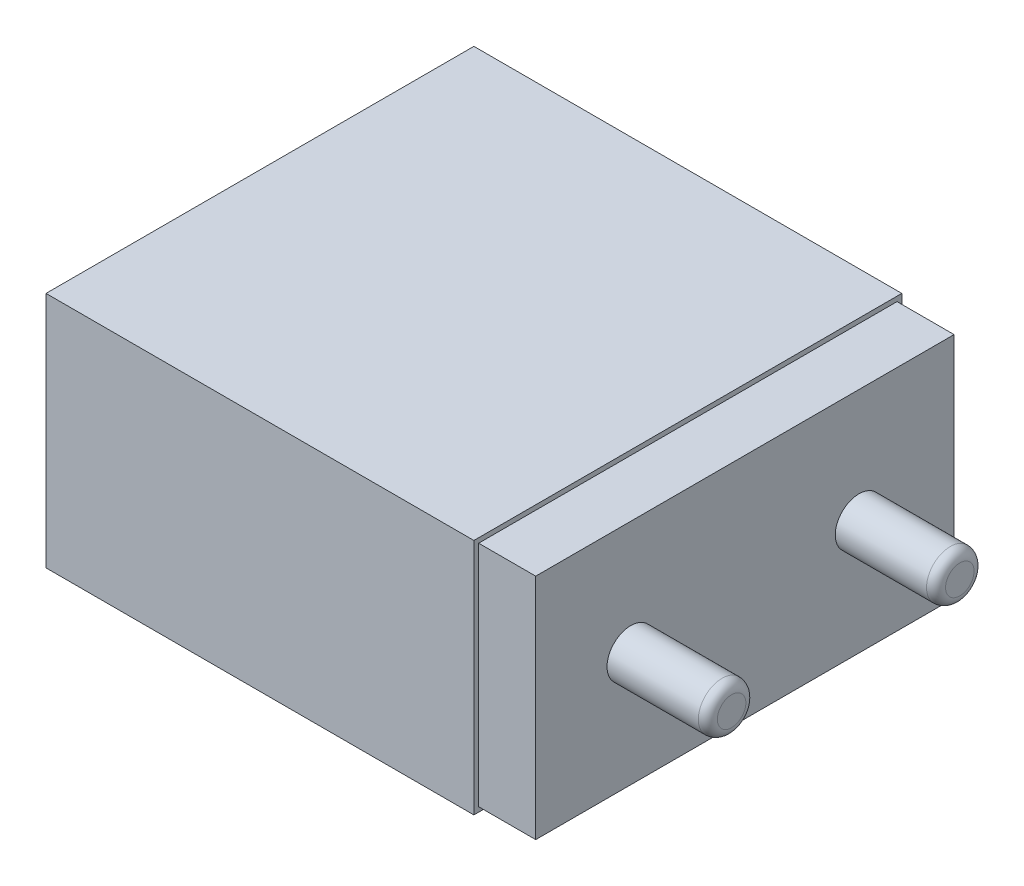
ISO-10303-21;
HEADER;
FILE_DESCRIPTION(('STEP AP214'),'2;1');
FILE_NAME('part.step','',(''),(''),'','','');
FILE_SCHEMA(('AUTOMOTIVE_DESIGN { 1 0 10303 214 1 1 1 1 }'));
ENDSEC;
DATA;
#1=APPLICATION_CONTEXT('core data for automotive mechanical design processes');
#2=APPLICATION_PROTOCOL_DEFINITION('international standard','automotive_design',2000,#1);
#3=PRODUCT_CONTEXT('',#1,'mechanical');
#4=PRODUCT('Part','Part','',(#3));
#5=PRODUCT_RELATED_PRODUCT_CATEGORY('part','',(#4));
#6=PRODUCT_DEFINITION_FORMATION('','',#4);
#7=PRODUCT_DEFINITION_CONTEXT('part definition',#1,'design');
#8=PRODUCT_DEFINITION('design','',#6,#7);
#9=PRODUCT_DEFINITION_SHAPE('','',#8);
#10=(LENGTH_UNIT() NAMED_UNIT(*) SI_UNIT(.MILLI.,.METRE.));
#11=(NAMED_UNIT(*) PLANE_ANGLE_UNIT() SI_UNIT($,.RADIAN.));
#12=(NAMED_UNIT(*) SI_UNIT($,.STERADIAN.) SOLID_ANGLE_UNIT());
#13=UNCERTAINTY_MEASURE_WITH_UNIT(LENGTH_MEASURE(1.E-05),#10,'distance_accuracy_value','');
#14=(GEOMETRIC_REPRESENTATION_CONTEXT(3) GLOBAL_UNCERTAINTY_ASSIGNED_CONTEXT((#13)) GLOBAL_UNIT_ASSIGNED_CONTEXT((#10,
#11,#12)) REPRESENTATION_CONTEXT('',''));
#15=CARTESIAN_POINT('',(0.,0.,0.));
#16=DIRECTION('',(0.,0.,1.));
#17=DIRECTION('',(1.,0.,0.));
#18=AXIS2_PLACEMENT_3D('',#15,#16,#17);
#19=CARTESIAN_POINT('',(-25.5789473684211,25.,-29.2105263157895));
#20=DIRECTION('',(1.,0.,0.));
#21=DIRECTION('',(0.,0.,-1.));
#22=AXIS2_PLACEMENT_3D('',#19,#20,#21);
#23=PLANE('',#22);
#24=DIRECTION('',(0.,0.,1.));
#25=VECTOR('',#24,1.);
#26=CARTESIAN_POINT('',(-25.5789473684211,0.,-29.2105263157895));
#27=LINE('',#26,#25);
#28=CARTESIAN_POINT('',(-25.5789473684211,0.,-29.2105263157895));
#29=VERTEX_POINT('',#28);
#30=CARTESIAN_POINT('',(-25.5789473684211,0.,15.7894736842105));
#31=VERTEX_POINT('',#30);
#32=EDGE_CURVE('E367',#29,#31,#27,.T.);
#33=ORIENTED_EDGE('',*,*,#32,.T.);
#34=DIRECTION('',(0.,-1.,0.));
#35=VECTOR('',#34,1.);
#36=CARTESIAN_POINT('',(-25.5789473684211,25.,15.7894736842105));
#37=LINE('',#36,#35);
#38=CARTESIAN_POINT('',(-25.5789473684211,25.,15.7894736842105));
#39=VERTEX_POINT('',#38);
#40=EDGE_CURVE('E405',#39,#31,#37,.T.);
#41=ORIENTED_EDGE('',*,*,#40,.F.);
#42=DIRECTION('',(0.,0.,1.));
#43=VECTOR('',#42,1.);
#44=CARTESIAN_POINT('',(-25.5789473684211,25.,-29.2105263157895));
#45=LINE('',#44,#43);
#46=CARTESIAN_POINT('',(-25.5789473684211,25.,-29.2105263157895));
#47=VERTEX_POINT('',#46);
#48=EDGE_CURVE('E368',#47,#39,#45,.T.);
#49=ORIENTED_EDGE('',*,*,#48,.F.);
#50=DIRECTION('',(0.,-1.,0.));
#51=VECTOR('',#50,1.);
#52=CARTESIAN_POINT('',(-25.5789473684211,25.,-29.2105263157895));
#53=LINE('',#52,#51);
#54=EDGE_CURVE('E382',#47,#29,#53,.T.);
#55=ORIENTED_EDGE('',*,*,#54,.T.);
#56=EDGE_LOOP('',(#33,#41,#49,#55));
#57=FACE_BOUND('',#56,.T.);
#58=DIRECTION('',(0.,0.,1.));
#59=VECTOR('',#58,1.);
#60=CARTESIAN_POINT('',(-25.5789473684211,7.95309160376509,-14.2105263157895));
#61=LINE('',#60,#59);
#62=CARTESIAN_POINT('',(-25.5789473684211,7.9530916037651,-14.2105263157895));
#63=VERTEX_POINT('',#62);
#64=CARTESIAN_POINT('',(-25.5789473684211,7.95309160376509,-9.21052631578947));
#65=VERTEX_POINT('',#64);
#66=EDGE_CURVE('E293',#63,#65,#61,.T.);
#67=ORIENTED_EDGE('',*,*,#66,.F.);
#68=DIRECTION('',(0.,-1.,0.));
#69=VECTOR('',#68,1.);
#70=CARTESIAN_POINT('',(-25.5789473684211,18.4530916037651,-14.2105263157895));
#71=LINE('',#70,#69);
#72=CARTESIAN_POINT('',(-25.5789473684211,18.4530916037651,-14.2105263157895));
#73=VERTEX_POINT('',#72);
#74=EDGE_CURVE('E226',#73,#63,#71,.T.);
#75=ORIENTED_EDGE('',*,*,#74,.F.);
#76=DIRECTION('',(0.,0.,-1.));
#77=VECTOR('',#76,1.);
#78=CARTESIAN_POINT('',(-25.5789473684211,18.4530916037651,-14.2105263157895));
#79=LINE('',#78,#77);
#80=CARTESIAN_POINT('',(-25.5789473684211,18.4530916037651,-9.21052631578947));
#81=VERTEX_POINT('',#80);
#82=EDGE_CURVE('E278',#81,#73,#79,.T.);
#83=ORIENTED_EDGE('',*,*,#82,.F.);
#84=DIRECTION('',(0.,1.,0.));
#85=VECTOR('',#84,1.);
#86=CARTESIAN_POINT('',(-25.5789473684211,18.4530916037651,-9.21052631578947));
#87=LINE('',#86,#85);
#88=EDGE_CURVE('E297',#65,#81,#87,.T.);
#89=ORIENTED_EDGE('',*,*,#88,.F.);
#90=EDGE_LOOP('',(#67,#75,#83,#89));
#91=FACE_BOUND('',#90,.T.);
#92=DIRECTION('',(0.,0.,1.));
#93=VECTOR('',#92,1.);
#94=CARTESIAN_POINT('',(-25.5789473684211,7.95309160376509,-24.2105263157895));
#95=LINE('',#94,#93);
#96=CARTESIAN_POINT('',(-25.5789473684211,7.95309160376509,-24.2105263157895));
#97=VERTEX_POINT('',#96);
#98=CARTESIAN_POINT('',(-25.5789473684211,7.95309160376509,-19.2105263157895));
#99=VERTEX_POINT('',#98);
#100=EDGE_CURVE('E248',#97,#99,#95,.T.);
#101=ORIENTED_EDGE('',*,*,#100,.F.);
#102=DIRECTION('',(0.,-1.,0.));
#103=VECTOR('',#102,1.);
#104=CARTESIAN_POINT('',(-25.5789473684211,18.4530916037651,-24.2105263157895));
#105=LINE('',#104,#103);
#106=CARTESIAN_POINT('',(-25.5789473684211,18.4530916037651,-24.2105263157895));
#107=VERTEX_POINT('',#106);
#108=EDGE_CURVE('E245',#107,#97,#105,.T.);
#109=ORIENTED_EDGE('',*,*,#108,.F.);
#110=DIRECTION('',(0.,0.,-1.));
#111=VECTOR('',#110,1.);
#112=CARTESIAN_POINT('',(-25.5789473684211,18.4530916037651,-24.2105263157895));
#113=LINE('',#112,#111);
#114=CARTESIAN_POINT('',(-25.5789473684211,18.4530916037651,-19.2105263157895));
#115=VERTEX_POINT('',#114);
#116=EDGE_CURVE('E232',#115,#107,#113,.T.);
#117=ORIENTED_EDGE('',*,*,#116,.F.);
#118=DIRECTION('',(0.,1.,0.));
#119=VECTOR('',#118,1.);
#120=CARTESIAN_POINT('',(-25.5789473684211,18.4530916037651,-19.2105263157895));
#121=LINE('',#120,#119);
#122=EDGE_CURVE('E253',#99,#115,#121,.T.);
#123=ORIENTED_EDGE('',*,*,#122,.F.);
#124=EDGE_LOOP('',(#101,#109,#117,#123));
#125=FACE_BOUND('',#124,.T.);
#126=DIRECTION('',(0.,-1.,0.));
#127=VECTOR('',#126,1.);
#128=CARTESIAN_POINT('',(-25.5789473684211,18.4530916037651,-4.21052631578948));
#129=LINE('',#128,#127);
#130=CARTESIAN_POINT('',(-25.5789473684211,18.4530916037651,-4.21052631578948));
#131=VERTEX_POINT('',#130);
#132=CARTESIAN_POINT('',(-25.5789473684211,7.9530916037651,-4.21052631578947));
#133=VERTEX_POINT('',#132);
#134=EDGE_CURVE('E192',#131,#133,#129,.T.);
#135=ORIENTED_EDGE('',*,*,#134,.F.);
#136=DIRECTION('',(0.,0.,-1.));
#137=VECTOR('',#136,1.);
#138=CARTESIAN_POINT('',(-25.5789473684211,18.4530916037651,-4.21052631578948));
#139=LINE('',#138,#137);
#140=CARTESIAN_POINT('',(-25.5789473684211,18.4530916037651,10.7894736842105));
#141=VERTEX_POINT('',#140);
#142=EDGE_CURVE('E198',#141,#131,#139,.T.);
#143=ORIENTED_EDGE('',*,*,#142,.F.);
#144=DIRECTION('',(0.,1.,0.));
#145=VECTOR('',#144,1.);
#146=CARTESIAN_POINT('',(-25.5789473684211,18.4530916037651,10.7894736842105));
#147=LINE('',#146,#145);
#148=CARTESIAN_POINT('',(-25.5789473684211,7.9530916037651,10.7894736842105));
#149=VERTEX_POINT('',#148);
#150=EDGE_CURVE('E212',#149,#141,#147,.T.);
#151=ORIENTED_EDGE('',*,*,#150,.F.);
#152=DIRECTION('',(0.,0.,1.));
#153=VECTOR('',#152,1.);
#154=CARTESIAN_POINT('',(-25.5789473684211,7.95309160376509,-4.21052631578947));
#155=LINE('',#154,#153);
#156=EDGE_CURVE('E206',#133,#149,#155,.T.);
#157=ORIENTED_EDGE('',*,*,#156,.F.);
#158=EDGE_LOOP('',(#135,#143,#151,#157));
#159=FACE_BOUND('',#158,.T.);
#160=ADVANCED_FACE('F41',(#57,#91,#125,#159),#23,.F.);
#161=CARTESIAN_POINT('',(19.4210526315789,25.,-29.2105263157895));
#162=DIRECTION('',(-1.,0.,0.));
#163=DIRECTION('',(0.,0.,1.));
#164=AXIS2_PLACEMENT_3D('',#161,#162,#163);
#165=PLANE('',#164);
#166=DIRECTION('',(0.,0.,-1.));
#167=VECTOR('',#166,1.);
#168=CARTESIAN_POINT('',(19.4210526315789,0.,-29.2105263157895));
#169=LINE('',#168,#167);
#170=CARTESIAN_POINT('',(19.4210526315789,0.,15.7894736842105));
#171=VERTEX_POINT('',#170);
#172=CARTESIAN_POINT('',(19.4210526315789,0.,-29.2105263157895));
#173=VERTEX_POINT('',#172);
#174=EDGE_CURVE('E389',#171,#173,#169,.T.);
#175=ORIENTED_EDGE('',*,*,#174,.T.);
#176=DIRECTION('',(0.,-1.,0.));
#177=VECTOR('',#176,1.);
#178=CARTESIAN_POINT('',(19.4210526315789,25.,-29.2105263157895));
#179=LINE('',#178,#177);
#180=CARTESIAN_POINT('',(19.4210526315789,25.,-29.2105263157895));
#181=VERTEX_POINT('',#180);
#182=EDGE_CURVE('E397',#181,#173,#179,.T.);
#183=ORIENTED_EDGE('',*,*,#182,.F.);
#184=DIRECTION('',(0.,0.,-1.));
#185=VECTOR('',#184,1.);
#186=CARTESIAN_POINT('',(19.4210526315789,25.,-29.2105263157895));
#187=LINE('',#186,#185);
#188=CARTESIAN_POINT('',(19.4210526315789,25.,15.7894736842105));
#189=VERTEX_POINT('',#188);
#190=EDGE_CURVE('E376',#189,#181,#187,.T.);
#191=ORIENTED_EDGE('',*,*,#190,.F.);
#192=DIRECTION('',(0.,-1.,0.));
#193=VECTOR('',#192,1.);
#194=CARTESIAN_POINT('',(19.4210526315789,25.,15.7894736842105));
#195=LINE('',#194,#193);
#196=EDGE_CURVE('E401',#189,#171,#195,.T.);
#197=ORIENTED_EDGE('',*,*,#196,.T.);
#198=EDGE_LOOP('',(#175,#183,#191,#197));
#199=FACE_BOUND('',#198,.T.);
#200=DIRECTION('',(0.,-1.,0.));
#201=VECTOR('',#200,1.);
#202=CARTESIAN_POINT('',(19.4210526315789,24.5,15.2894736842105));
#203=LINE('',#202,#201);
#204=CARTESIAN_POINT('',(19.4210526315789,24.5,15.2894736842105));
#205=VERTEX_POINT('',#204);
#206=CARTESIAN_POINT('',(19.4210526315789,0.5,15.2894736842105));
#207=VERTEX_POINT('',#206);
#208=EDGE_CURVE('E322',#205,#207,#203,.T.);
#209=ORIENTED_EDGE('',*,*,#208,.F.);
#210=DIRECTION('',(0.,0.,1.));
#211=VECTOR('',#210,1.);
#212=CARTESIAN_POINT('',(19.4210526315789,24.5,15.2894736842105));
#213=LINE('',#212,#211);
#214=CARTESIAN_POINT('',(19.4210526315789,24.5,-28.7105263157895));
#215=VERTEX_POINT('',#214);
#216=EDGE_CURVE('E328',#215,#205,#213,.T.);
#217=ORIENTED_EDGE('',*,*,#216,.F.);
#218=DIRECTION('',(0.,1.,0.));
#219=VECTOR('',#218,1.);
#220=CARTESIAN_POINT('',(19.4210526315789,24.5,-28.7105263157895));
#221=LINE('',#220,#219);
#222=CARTESIAN_POINT('',(19.4210526315789,0.5,-28.7105263157895));
#223=VERTEX_POINT('',#222);
#224=EDGE_CURVE('E345',#223,#215,#221,.T.);
#225=ORIENTED_EDGE('',*,*,#224,.F.);
#226=DIRECTION('',(0.,0.,-1.));
#227=VECTOR('',#226,1.);
#228=CARTESIAN_POINT('',(19.4210526315789,0.5,15.2894736842105));
#229=LINE('',#228,#227);
#230=EDGE_CURVE('E341',#207,#223,#229,.T.);
#231=ORIENTED_EDGE('',*,*,#230,.F.);
#232=EDGE_LOOP('',(#209,#217,#225,#231));
#233=FACE_BOUND('',#232,.T.);
#234=ADVANCED_FACE('F485',(#199,#233),#165,.F.);
#235=CARTESIAN_POINT('',(-25.5789473684211,25.,15.7894736842105));
#236=DIRECTION('',(0.,0.,-1.));
#237=DIRECTION('',(-1.,0.,0.));
#238=AXIS2_PLACEMENT_3D('',#235,#236,#237);
#239=PLANE('',#238);
#240=DIRECTION('',(1.,0.,0.));
#241=VECTOR('',#240,1.);
#242=CARTESIAN_POINT('',(-25.5789473684211,0.,15.7894736842105));
#243=LINE('',#242,#241);
#244=EDGE_CURVE('E386',#31,#171,#243,.T.);
#245=ORIENTED_EDGE('',*,*,#244,.T.);
#246=ORIENTED_EDGE('',*,*,#196,.F.);
#247=DIRECTION('',(1.,0.,0.));
#248=VECTOR('',#247,1.);
#249=CARTESIAN_POINT('',(-25.5789473684211,25.,15.7894736842105));
#250=LINE('',#249,#248);
#251=EDGE_CURVE('E372',#39,#189,#250,.T.);
#252=ORIENTED_EDGE('',*,*,#251,.F.);
#253=ORIENTED_EDGE('',*,*,#40,.T.);
#254=EDGE_LOOP('',(#245,#246,#252,#253));
#255=FACE_BOUND('',#254,.T.);
#256=ADVANCED_FACE('F491',(#255),#239,.F.);
#257=CARTESIAN_POINT('',(-25.5789473684211,25.,-29.2105263157895));
#258=DIRECTION('',(0.,0.,1.));
#259=DIRECTION('',(1.,0.,0.));
#260=AXIS2_PLACEMENT_3D('',#257,#258,#259);
#261=PLANE('',#260);
#262=DIRECTION('',(-1.,0.,0.));
#263=VECTOR('',#262,1.);
#264=CARTESIAN_POINT('',(-25.5789473684211,0.,-29.2105263157895));
#265=LINE('',#264,#263);
#266=EDGE_CURVE('E373',#173,#29,#265,.T.);
#267=ORIENTED_EDGE('',*,*,#266,.T.);
#268=ORIENTED_EDGE('',*,*,#54,.F.);
#269=DIRECTION('',(-1.,0.,0.));
#270=VECTOR('',#269,1.);
#271=CARTESIAN_POINT('',(-25.5789473684211,25.,-29.2105263157895));
#272=LINE('',#271,#270);
#273=EDGE_CURVE('E379',#181,#47,#272,.T.);
#274=ORIENTED_EDGE('',*,*,#273,.F.);
#275=ORIENTED_EDGE('',*,*,#182,.T.);
#276=EDGE_LOOP('',(#267,#268,#274,#275));
#277=FACE_BOUND('',#276,.T.);
#278=ADVANCED_FACE('F770',(#277),#261,.F.);
#279=CARTESIAN_POINT('',(0.,25.,0.));
#280=DIRECTION('',(0.,1.,0.));
#281=DIRECTION('',(0.,0.,1.));
#282=AXIS2_PLACEMENT_3D('',#279,#280,#281);
#283=PLANE('',#282);
#284=ORIENTED_EDGE('',*,*,#48,.T.);
#285=ORIENTED_EDGE('',*,*,#251,.T.);
#286=ORIENTED_EDGE('',*,*,#190,.T.);
#287=ORIENTED_EDGE('',*,*,#273,.T.);
#288=EDGE_LOOP('',(#284,#285,#286,#287));
#289=FACE_BOUND('',#288,.T.);
#290=ADVANCED_FACE('F761',(#289),#283,.T.);
#291=CARTESIAN_POINT('',(0.,0.,0.));
#292=DIRECTION('',(0.,1.,0.));
#293=DIRECTION('',(0.,0.,1.));
#294=AXIS2_PLACEMENT_3D('',#291,#292,#293);
#295=PLANE('',#294);
#296=ORIENTED_EDGE('',*,*,#32,.F.);
#297=ORIENTED_EDGE('',*,*,#266,.F.);
#298=ORIENTED_EDGE('',*,*,#174,.F.);
#299=ORIENTED_EDGE('',*,*,#244,.F.);
#300=EDGE_LOOP('',(#296,#297,#298,#299));
#301=FACE_BOUND('',#300,.T.);
#302=ADVANCED_FACE('F747',(#301),#295,.F.);
#303=CARTESIAN_POINT('',(25.4210526315789,24.5,15.2894736842105));
#304=DIRECTION('',(0.,0.,-1.));
#305=DIRECTION('',(-1.,0.,0.));
#306=AXIS2_PLACEMENT_3D('',#303,#304,#305);
#307=PLANE('',#306);
#308=ORIENTED_EDGE('',*,*,#208,.T.);
#309=DIRECTION('',(-1.,0.,0.));
#310=VECTOR('',#309,1.);
#311=CARTESIAN_POINT('',(25.4210526315789,0.5,15.2894736842105));
#312=LINE('',#311,#310);
#313=CARTESIAN_POINT('',(25.4210526315789,0.5,15.2894736842105));
#314=VERTEX_POINT('',#313);
#315=EDGE_CURVE('E363',#314,#207,#312,.T.);
#316=ORIENTED_EDGE('',*,*,#315,.F.);
#317=DIRECTION('',(0.,-1.,0.));
#318=VECTOR('',#317,1.);
#319=CARTESIAN_POINT('',(25.4210526315789,24.5,15.2894736842105));
#320=LINE('',#319,#318);
#321=CARTESIAN_POINT('',(25.4210526315789,24.5,15.2894736842105));
#322=VERTEX_POINT('',#321);
#323=EDGE_CURVE('E323',#322,#314,#320,.T.);
#324=ORIENTED_EDGE('',*,*,#323,.F.);
#325=DIRECTION('',(-1.,0.,0.));
#326=VECTOR('',#325,1.);
#327=CARTESIAN_POINT('',(25.4210526315789,24.5,15.2894736842105));
#328=LINE('',#327,#326);
#329=EDGE_CURVE('E337',#322,#205,#328,.T.);
#330=ORIENTED_EDGE('',*,*,#329,.T.);
#331=EDGE_LOOP('',(#308,#316,#324,#330));
#332=FACE_BOUND('',#331,.T.);
#333=ADVANCED_FACE('F738',(#332),#307,.F.);
#334=CARTESIAN_POINT('',(25.4210526315789,0.5,15.2894736842105));
#335=DIRECTION('',(0.,1.,0.));
#336=DIRECTION('',(0.,0.,1.));
#337=AXIS2_PLACEMENT_3D('',#334,#335,#336);
#338=PLANE('',#337);
#339=ORIENTED_EDGE('',*,*,#230,.T.);
#340=DIRECTION('',(-1.,0.,0.));
#341=VECTOR('',#340,1.);
#342=CARTESIAN_POINT('',(25.4210526315789,0.5,-28.7105263157895));
#343=LINE('',#342,#341);
#344=CARTESIAN_POINT('',(25.4210526315789,0.5,-28.7105263157895));
#345=VERTEX_POINT('',#344);
#346=EDGE_CURVE('E359',#345,#223,#343,.T.);
#347=ORIENTED_EDGE('',*,*,#346,.F.);
#348=DIRECTION('',(0.,0.,-1.));
#349=VECTOR('',#348,1.);
#350=CARTESIAN_POINT('',(25.4210526315789,0.5,15.2894736842105));
#351=LINE('',#350,#349);
#352=EDGE_CURVE('E327',#314,#345,#351,.T.);
#353=ORIENTED_EDGE('',*,*,#352,.F.);
#354=ORIENTED_EDGE('',*,*,#315,.T.);
#355=EDGE_LOOP('',(#339,#347,#353,#354));
#356=FACE_BOUND('',#355,.T.);
#357=ADVANCED_FACE('F729',(#356),#338,.F.);
#358=CARTESIAN_POINT('',(25.4210526315789,24.5,-28.7105263157895));
#359=DIRECTION('',(0.,0.,1.));
#360=DIRECTION('',(0.,-1.,0.));
#361=AXIS2_PLACEMENT_3D('',#358,#359,#360);
#362=PLANE('',#361);
#363=ORIENTED_EDGE('',*,*,#224,.T.);
#364=DIRECTION('',(-1.,0.,0.));
#365=VECTOR('',#364,1.);
#366=CARTESIAN_POINT('',(25.4210526315789,24.5,-28.7105263157895));
#367=LINE('',#366,#365);
#368=CARTESIAN_POINT('',(25.4210526315789,24.5,-28.7105263157895));
#369=VERTEX_POINT('',#368);
#370=EDGE_CURVE('E355',#369,#215,#367,.T.);
#371=ORIENTED_EDGE('',*,*,#370,.F.);
#372=DIRECTION('',(0.,1.,0.));
#373=VECTOR('',#372,1.);
#374=CARTESIAN_POINT('',(25.4210526315789,24.5,-28.7105263157895));
#375=LINE('',#374,#373);
#376=EDGE_CURVE('E331',#345,#369,#375,.T.);
#377=ORIENTED_EDGE('',*,*,#376,.F.);
#378=ORIENTED_EDGE('',*,*,#346,.T.);
#379=EDGE_LOOP('',(#363,#371,#377,#378));
#380=FACE_BOUND('',#379,.T.);
#381=ADVANCED_FACE('F720',(#380),#362,.F.);
#382=CARTESIAN_POINT('',(25.4210526315789,24.5,15.2894736842105));
#383=DIRECTION('',(0.,-1.,0.));
#384=DIRECTION('',(0.,0.,-1.));
#385=AXIS2_PLACEMENT_3D('',#382,#383,#384);
#386=PLANE('',#385);
#387=ORIENTED_EDGE('',*,*,#216,.T.);
#388=ORIENTED_EDGE('',*,*,#329,.F.);
#389=DIRECTION('',(0.,0.,1.));
#390=VECTOR('',#389,1.);
#391=CARTESIAN_POINT('',(25.4210526315789,24.5,15.2894736842105));
#392=LINE('',#391,#390);
#393=EDGE_CURVE('E334',#369,#322,#392,.T.);
#394=ORIENTED_EDGE('',*,*,#393,.F.);
#395=ORIENTED_EDGE('',*,*,#370,.T.);
#396=EDGE_LOOP('',(#387,#388,#394,#395));
#397=FACE_BOUND('',#396,.T.);
#398=ADVANCED_FACE('F711',(#397),#386,.F.);
#399=CARTESIAN_POINT('',(25.4210526315789,0.,0.));
#400=DIRECTION('',(1.,0.,0.));
#401=DIRECTION('',(0.,0.,-1.));
#402=AXIS2_PLACEMENT_3D('',#399,#400,#401);
#403=PLANE('',#402);
#404=CARTESIAN_POINT('',(25.4210526315789,12.5,5.28947368421052));
#405=DIRECTION('',(1.,0.,0.));
#406=DIRECTION('',(0.,0.,-1.));
#407=AXIS2_PLACEMENT_3D('',#404,#405,#406);
#408=CIRCLE('',#407,2.5);
#409=CARTESIAN_POINT('',(25.4210526315789,12.5,2.78947368421052));
#410=VERTEX_POINT('',#409);
#411=EDGE_CURVE('E263',#410,#410,#408,.T.);
#412=ORIENTED_EDGE('',*,*,#411,.F.);
#413=EDGE_LOOP('',(#412));
#414=FACE_BOUND('',#413,.T.);
#415=CARTESIAN_POINT('',(25.4210526315789,12.5,-18.7105263157895));
#416=DIRECTION('',(1.,0.,0.));
#417=DIRECTION('',(0.,0.,-1.));
#418=AXIS2_PLACEMENT_3D('',#415,#416,#417);
#419=CIRCLE('',#418,2.5);
#420=CARTESIAN_POINT('',(25.4210526315789,12.5,-21.2105263157895));
#421=VERTEX_POINT('',#420);
#422=EDGE_CURVE('E318',#421,#421,#419,.T.);
#423=ORIENTED_EDGE('',*,*,#422,.F.);
#424=EDGE_LOOP('',(#423));
#425=FACE_BOUND('',#424,.T.);
#426=ORIENTED_EDGE('',*,*,#323,.T.);
#427=ORIENTED_EDGE('',*,*,#352,.T.);
#428=ORIENTED_EDGE('',*,*,#376,.T.);
#429=ORIENTED_EDGE('',*,*,#393,.T.);
#430=EDGE_LOOP('',(#426,#427,#428,#429));
#431=FACE_BOUND('',#430,.T.);
#432=ADVANCED_FACE('F703',(#414,#425,#431),#403,.T.);
#433=CARTESIAN_POINT('',(36.0210526315789,12.5,-18.7105263157895));
#434=DIRECTION('',(-1.,0.,0.));
#435=DIRECTION('',(0.,0.,1.));
#436=AXIS2_PLACEMENT_3D('',#433,#434,#435);
#437=CYLINDRICAL_SURFACE('',#436,2.5);
#438=CARTESIAN_POINT('',(35.0210526315789,12.5,-18.7105263157895));
#439=DIRECTION('',(1.,0.,0.));
#440=DIRECTION('',(0.,0.,-1.));
#441=AXIS2_PLACEMENT_3D('',#438,#439,#440);
#442=CIRCLE('',#441,2.5);
#443=CARTESIAN_POINT('',(35.0210526315789,12.5,-21.2105263157895));
#444=VERTEX_POINT('',#443);
#445=EDGE_CURVE('E421',#444,#444,#442,.F.);
#446=ORIENTED_EDGE('',*,*,#445,.T.);
#447=EDGE_LOOP('',(#446));
#448=FACE_BOUND('',#447,.T.);
#449=ORIENTED_EDGE('',*,*,#422,.T.);
#450=EDGE_LOOP('',(#449));
#451=FACE_BOUND('',#450,.T.);
#452=ADVANCED_FACE('F695',(#448,#451),#437,.T.);
#453=CARTESIAN_POINT('',(36.0210526315789,12.5,-18.7105263157895));
#454=DIRECTION('',(1.,0.,0.));
#455=DIRECTION('',(0.,0.,-1.));
#456=AXIS2_PLACEMENT_3D('',#453,#454,#455);
#457=PLANE('',#456);
#458=CARTESIAN_POINT('',(36.0210526315789,12.5,-18.7105263157895));
#459=DIRECTION('',(1.,0.,0.));
#460=DIRECTION('',(0.,0.,-1.));
#461=AXIS2_PLACEMENT_3D('',#458,#459,#460);
#462=CIRCLE('',#461,1.5);
#463=CARTESIAN_POINT('',(36.0210526315789,12.5,-20.2105263157895));
#464=VERTEX_POINT('',#463);
#465=EDGE_CURVE('E417',#464,#464,#462,.T.);
#466=ORIENTED_EDGE('',*,*,#465,.T.);
#467=EDGE_LOOP('',(#466));
#468=FACE_BOUND('',#467,.T.);
#469=ADVANCED_FACE('F686',(#468),#457,.T.);
#470=CARTESIAN_POINT('',(36.0210526315789,12.5,5.28947368421052));
#471=DIRECTION('',(-1.,0.,0.));
#472=DIRECTION('',(0.,0.,1.));
#473=AXIS2_PLACEMENT_3D('',#470,#471,#472);
#474=CYLINDRICAL_SURFACE('',#473,2.5);
#475=CARTESIAN_POINT('',(35.0210526315789,12.5,5.28947368421052));
#476=DIRECTION('',(1.,0.,0.));
#477=DIRECTION('',(0.,0.,-1.));
#478=AXIS2_PLACEMENT_3D('',#475,#476,#477);
#479=CIRCLE('',#478,2.5);
#480=CARTESIAN_POINT('',(35.0210526315789,12.5,2.78947368421052));
#481=VERTEX_POINT('',#480);
#482=EDGE_CURVE('E413',#481,#481,#479,.F.);
#483=ORIENTED_EDGE('',*,*,#482,.T.);
#484=EDGE_LOOP('',(#483));
#485=FACE_BOUND('',#484,.T.);
#486=ORIENTED_EDGE('',*,*,#411,.T.);
#487=EDGE_LOOP('',(#486));
#488=FACE_BOUND('',#487,.T.);
#489=ADVANCED_FACE('F677',(#485,#488),#474,.T.);
#490=CARTESIAN_POINT('',(36.0210526315789,12.5,5.28947368421052));
#491=DIRECTION('',(1.,0.,0.));
#492=DIRECTION('',(0.,0.,-1.));
#493=AXIS2_PLACEMENT_3D('',#490,#491,#492);
#494=PLANE('',#493);
#495=CARTESIAN_POINT('',(36.0210526315789,12.5,5.28947368421052));
#496=DIRECTION('',(1.,0.,0.));
#497=DIRECTION('',(0.,0.,-1.));
#498=AXIS2_PLACEMENT_3D('',#495,#496,#497);
#499=CIRCLE('',#498,1.5);
#500=CARTESIAN_POINT('',(36.0210526315789,12.5,3.78947368421052));
#501=VERTEX_POINT('',#500);
#502=EDGE_CURVE('E409',#501,#501,#499,.T.);
#503=ORIENTED_EDGE('',*,*,#502,.T.);
#504=EDGE_LOOP('',(#503));
#505=FACE_BOUND('',#504,.T.);
#506=ADVANCED_FACE('F501',(#505),#494,.T.);
#507=CARTESIAN_POINT('',(35.0210526315789,12.5,5.28947368421052));
#508=DIRECTION('',(1.,0.,0.));
#509=DIRECTION('',(0.,0.,-1.));
#510=AXIS2_PLACEMENT_3D('',#507,#508,#509);
#511=TOROIDAL_SURFACE('',#510,1.5,1.);
#512=ORIENTED_EDGE('',*,*,#482,.F.);
#513=EDGE_LOOP('',(#512));
#514=FACE_BOUND('',#513,.T.);
#515=ORIENTED_EDGE('',*,*,#502,.F.);
#516=EDGE_LOOP('',(#515));
#517=FACE_BOUND('',#516,.T.);
#518=ADVANCED_FACE('F497',(#514,#517),#511,.T.);
#519=CARTESIAN_POINT('',(35.0210526315789,12.5,-18.7105263157895));
#520=DIRECTION('',(1.,0.,0.));
#521=DIRECTION('',(0.,0.,-1.));
#522=AXIS2_PLACEMENT_3D('',#519,#520,#521);
#523=TOROIDAL_SURFACE('',#522,1.5,1.);
#524=ORIENTED_EDGE('',*,*,#445,.F.);
#525=EDGE_LOOP('',(#524));
#526=FACE_BOUND('',#525,.T.);
#527=ORIENTED_EDGE('',*,*,#465,.F.);
#528=EDGE_LOOP('',(#527));
#529=FACE_BOUND('',#528,.T.);
#530=ADVANCED_FACE('F500',(#526,#529),#523,.T.);
#531=CARTESIAN_POINT('',(-15.0789473684211,18.4530916037651,-14.2105263157895));
#532=DIRECTION('',(0.,0.,-1.));
#533=DIRECTION('',(0.,1.,0.));
#534=AXIS2_PLACEMENT_3D('',#531,#532,#533);
#535=PLANE('',#534);
#536=ORIENTED_EDGE('',*,*,#74,.T.);
#537=DIRECTION('',(-1.,0.,0.));
#538=VECTOR('',#537,1.);
#539=CARTESIAN_POINT('',(-15.0789473684211,7.95309160376509,-14.2105263157895));
#540=LINE('',#539,#538);
#541=CARTESIAN_POINT('',(-15.0789473684211,7.95309160376509,-14.2105263157895));
#542=VERTEX_POINT('',#541);
#543=EDGE_CURVE('E290',#542,#63,#540,.T.);
#544=ORIENTED_EDGE('',*,*,#543,.F.);
#545=DIRECTION('',(0.,-1.,0.));
#546=VECTOR('',#545,1.);
#547=CARTESIAN_POINT('',(-15.0789473684211,18.4530916037651,-14.2105263157895));
#548=LINE('',#547,#546);
#549=CARTESIAN_POINT('',(-15.0789473684211,18.4530916037651,-14.2105263157895));
#550=VERTEX_POINT('',#549);
#551=EDGE_CURVE('E273',#550,#542,#548,.T.);
#552=ORIENTED_EDGE('',*,*,#551,.F.);
#553=DIRECTION('',(-1.,0.,0.));
#554=VECTOR('',#553,1.);
#555=CARTESIAN_POINT('',(-15.0789473684211,18.4530916037651,-14.2105263157895));
#556=LINE('',#555,#554);
#557=EDGE_CURVE('E249',#550,#73,#556,.T.);
#558=ORIENTED_EDGE('',*,*,#557,.T.);
#559=EDGE_LOOP('',(#536,#544,#552,#558));
#560=FACE_BOUND('',#559,.T.);
#561=ADVANCED_FACE('F505',(#560),#535,.F.);
#562=CARTESIAN_POINT('',(-15.0789473684211,18.4530916037651,-14.2105263157895));
#563=DIRECTION('',(0.,1.,0.));
#564=DIRECTION('',(0.,0.,1.));
#565=AXIS2_PLACEMENT_3D('',#562,#563,#564);
#566=PLANE('',#565);
#567=ORIENTED_EDGE('',*,*,#82,.T.);
#568=ORIENTED_EDGE('',*,*,#557,.F.);
#569=DIRECTION('',(0.,0.,-1.));
#570=VECTOR('',#569,1.);
#571=CARTESIAN_POINT('',(-15.0789473684211,18.4530916037651,-14.2105263157895));
#572=LINE('',#571,#570);
#573=CARTESIAN_POINT('',(-15.0789473684211,18.4530916037651,-9.21052631578947));
#574=VERTEX_POINT('',#573);
#575=EDGE_CURVE('E286',#574,#550,#572,.T.);
#576=ORIENTED_EDGE('',*,*,#575,.F.);
#577=DIRECTION('',(-1.,0.,0.));
#578=VECTOR('',#577,1.);
#579=CARTESIAN_POINT('',(-15.0789473684211,18.4530916037651,-9.21052631578947));
#580=LINE('',#579,#578);
#581=EDGE_CURVE('E306',#574,#81,#580,.T.);
#582=ORIENTED_EDGE('',*,*,#581,.T.);
#583=EDGE_LOOP('',(#567,#568,#576,#582));
#584=FACE_BOUND('',#583,.T.);
#585=ADVANCED_FACE('F640',(#584),#566,.F.);
#586=CARTESIAN_POINT('',(-15.0789473684211,18.4530916037651,-9.21052631578947));
#587=DIRECTION('',(0.,0.,1.));
#588=DIRECTION('',(1.,0.,0.));
#589=AXIS2_PLACEMENT_3D('',#586,#587,#588);
#590=PLANE('',#589);
#591=ORIENTED_EDGE('',*,*,#88,.T.);
#592=ORIENTED_EDGE('',*,*,#581,.F.);
#593=DIRECTION('',(0.,1.,0.));
#594=VECTOR('',#593,1.);
#595=CARTESIAN_POINT('',(-15.0789473684211,18.4530916037651,-9.21052631578947));
#596=LINE('',#595,#594);
#597=CARTESIAN_POINT('',(-15.0789473684211,7.95309160376509,-9.21052631578947));
#598=VERTEX_POINT('',#597);
#599=EDGE_CURVE('E282',#598,#574,#596,.T.);
#600=ORIENTED_EDGE('',*,*,#599,.F.);
#601=DIRECTION('',(-1.,0.,0.));
#602=VECTOR('',#601,1.);
#603=CARTESIAN_POINT('',(-15.0789473684211,7.95309160376509,-9.21052631578947));
#604=LINE('',#603,#602);
#605=EDGE_CURVE('E309',#598,#65,#604,.T.);
#606=ORIENTED_EDGE('',*,*,#605,.T.);
#607=EDGE_LOOP('',(#591,#592,#600,#606));
#608=FACE_BOUND('',#607,.T.);
#609=ADVANCED_FACE('F631',(#608),#590,.F.);
#610=CARTESIAN_POINT('',(-15.0789473684211,7.95309160376509,-14.2105263157895));
#611=DIRECTION('',(0.,-1.,0.));
#612=DIRECTION('',(0.,0.,-1.));
#613=AXIS2_PLACEMENT_3D('',#610,#611,#612);
#614=PLANE('',#613);
#615=ORIENTED_EDGE('',*,*,#66,.T.);
#616=ORIENTED_EDGE('',*,*,#605,.F.);
#617=DIRECTION('',(0.,0.,1.));
#618=VECTOR('',#617,1.);
#619=CARTESIAN_POINT('',(-15.0789473684211,7.95309160376509,-14.2105263157895));
#620=LINE('',#619,#618);
#621=EDGE_CURVE('E277',#542,#598,#620,.T.);
#622=ORIENTED_EDGE('',*,*,#621,.F.);
#623=ORIENTED_EDGE('',*,*,#543,.T.);
#624=EDGE_LOOP('',(#615,#616,#622,#623));
#625=FACE_BOUND('',#624,.T.);
#626=ADVANCED_FACE('F622',(#625),#614,.F.);
#627=CARTESIAN_POINT('',(-15.0789473684211,0.,0.));
#628=DIRECTION('',(-1.,0.,0.));
#629=DIRECTION('',(0.,0.,1.));
#630=AXIS2_PLACEMENT_3D('',#627,#628,#629);
#631=PLANE('',#630);
#632=ORIENTED_EDGE('',*,*,#551,.T.);
#633=ORIENTED_EDGE('',*,*,#621,.T.);
#634=ORIENTED_EDGE('',*,*,#599,.T.);
#635=ORIENTED_EDGE('',*,*,#575,.T.);
#636=EDGE_LOOP('',(#632,#633,#634,#635));
#637=FACE_BOUND('',#636,.T.);
#638=ADVANCED_FACE('F613',(#637),#631,.T.);
#639=CARTESIAN_POINT('',(-15.0789473684211,18.4530916037651,-24.2105263157895));
#640=DIRECTION('',(0.,0.,-1.));
#641=DIRECTION('',(-1.,0.,0.));
#642=AXIS2_PLACEMENT_3D('',#639,#640,#641);
#643=PLANE('',#642);
#644=ORIENTED_EDGE('',*,*,#108,.T.);
#645=DIRECTION('',(-1.,0.,0.));
#646=VECTOR('',#645,1.);
#647=CARTESIAN_POINT('',(-15.0789473684211,7.95309160376509,-24.2105263157895));
#648=LINE('',#647,#646);
#649=CARTESIAN_POINT('',(-15.0789473684211,7.95309160376509,-24.2105263157895));
#650=VERTEX_POINT('',#649);
#651=EDGE_CURVE('E244',#650,#97,#648,.T.);
#652=ORIENTED_EDGE('',*,*,#651,.F.);
#653=DIRECTION('',(0.,-1.,0.));
#654=VECTOR('',#653,1.);
#655=CARTESIAN_POINT('',(-15.0789473684211,18.4530916037651,-24.2105263157895));
#656=LINE('',#655,#654);
#657=CARTESIAN_POINT('',(-15.0789473684211,18.4530916037651,-24.2105263157895));
#658=VERTEX_POINT('',#657);
#659=EDGE_CURVE('E227',#658,#650,#656,.T.);
#660=ORIENTED_EDGE('',*,*,#659,.F.);
#661=DIRECTION('',(-1.,0.,0.));
#662=VECTOR('',#661,1.);
#663=CARTESIAN_POINT('',(-15.0789473684211,18.4530916037651,-24.2105263157895));
#664=LINE('',#663,#662);
#665=EDGE_CURVE('E260',#658,#107,#664,.T.);
#666=ORIENTED_EDGE('',*,*,#665,.T.);
#667=EDGE_LOOP('',(#644,#652,#660,#666));
#668=FACE_BOUND('',#667,.T.);
#669=ADVANCED_FACE('F604',(#668),#643,.F.);
#670=CARTESIAN_POINT('',(-15.0789473684211,18.4530916037651,-24.2105263157895));
#671=DIRECTION('',(0.,1.,0.));
#672=DIRECTION('',(0.,0.,1.));
#673=AXIS2_PLACEMENT_3D('',#670,#671,#672);
#674=PLANE('',#673);
#675=ORIENTED_EDGE('',*,*,#116,.T.);
#676=ORIENTED_EDGE('',*,*,#665,.F.);
#677=DIRECTION('',(0.,0.,-1.));
#678=VECTOR('',#677,1.);
#679=CARTESIAN_POINT('',(-15.0789473684211,18.4530916037651,-24.2105263157895));
#680=LINE('',#679,#678);
#681=CARTESIAN_POINT('',(-15.0789473684211,18.4530916037651,-19.2105263157895));
#682=VERTEX_POINT('',#681);
#683=EDGE_CURVE('E240',#682,#658,#680,.T.);
#684=ORIENTED_EDGE('',*,*,#683,.F.);
#685=DIRECTION('',(-1.,0.,0.));
#686=VECTOR('',#685,1.);
#687=CARTESIAN_POINT('',(-15.0789473684211,18.4530916037651,-19.2105263157895));
#688=LINE('',#687,#686);
#689=EDGE_CURVE('E264',#682,#115,#688,.T.);
#690=ORIENTED_EDGE('',*,*,#689,.T.);
#691=EDGE_LOOP('',(#675,#676,#684,#690));
#692=FACE_BOUND('',#691,.T.);
#693=ADVANCED_FACE('F595',(#692),#674,.F.);
#694=CARTESIAN_POINT('',(-15.0789473684211,18.4530916037651,-19.2105263157895));
#695=DIRECTION('',(0.,0.,1.));
#696=DIRECTION('',(0.,-1.,0.));
#697=AXIS2_PLACEMENT_3D('',#694,#695,#696);
#698=PLANE('',#697);
#699=ORIENTED_EDGE('',*,*,#122,.T.);
#700=ORIENTED_EDGE('',*,*,#689,.F.);
#701=DIRECTION('',(0.,1.,0.));
#702=VECTOR('',#701,1.);
#703=CARTESIAN_POINT('',(-15.0789473684211,18.4530916037651,-19.2105263157895));
#704=LINE('',#703,#702);
#705=CARTESIAN_POINT('',(-15.0789473684211,7.95309160376509,-19.2105263157895));
#706=VERTEX_POINT('',#705);
#707=EDGE_CURVE('E236',#706,#682,#704,.T.);
#708=ORIENTED_EDGE('',*,*,#707,.F.);
#709=DIRECTION('',(-1.,0.,0.));
#710=VECTOR('',#709,1.);
#711=CARTESIAN_POINT('',(-15.0789473684211,7.95309160376509,-19.2105263157895));
#712=LINE('',#711,#710);
#713=EDGE_CURVE('E267',#706,#99,#712,.T.);
#714=ORIENTED_EDGE('',*,*,#713,.T.);
#715=EDGE_LOOP('',(#699,#700,#708,#714));
#716=FACE_BOUND('',#715,.T.);
#717=ADVANCED_FACE('F586',(#716),#698,.F.);
#718=CARTESIAN_POINT('',(-15.0789473684211,7.95309160376509,-24.2105263157895));
#719=DIRECTION('',(0.,-1.,0.));
#720=DIRECTION('',(0.,0.,-1.));
#721=AXIS2_PLACEMENT_3D('',#718,#719,#720);
#722=PLANE('',#721);
#723=ORIENTED_EDGE('',*,*,#100,.T.);
#724=ORIENTED_EDGE('',*,*,#713,.F.);
#725=DIRECTION('',(0.,0.,1.));
#726=VECTOR('',#725,1.);
#727=CARTESIAN_POINT('',(-15.0789473684211,7.95309160376509,-24.2105263157895));
#728=LINE('',#727,#726);
#729=EDGE_CURVE('E231',#650,#706,#728,.T.);
#730=ORIENTED_EDGE('',*,*,#729,.F.);
#731=ORIENTED_EDGE('',*,*,#651,.T.);
#732=EDGE_LOOP('',(#723,#724,#730,#731));
#733=FACE_BOUND('',#732,.T.);
#734=ADVANCED_FACE('F577',(#733),#722,.F.);
#735=CARTESIAN_POINT('',(-15.0789473684211,0.,0.));
#736=DIRECTION('',(-1.,0.,0.));
#737=DIRECTION('',(0.,0.,1.));
#738=AXIS2_PLACEMENT_3D('',#735,#736,#737);
#739=PLANE('',#738);
#740=ORIENTED_EDGE('',*,*,#659,.T.);
#741=ORIENTED_EDGE('',*,*,#729,.T.);
#742=ORIENTED_EDGE('',*,*,#707,.T.);
#743=ORIENTED_EDGE('',*,*,#683,.T.);
#744=EDGE_LOOP('',(#740,#741,#742,#743));
#745=FACE_BOUND('',#744,.T.);
#746=ADVANCED_FACE('F565',(#745),#739,.T.);
#747=CARTESIAN_POINT('',(-26.0789473684211,18.4530916037651,-4.21052631578948));
#748=DIRECTION('',(0.,0.,1.));
#749=DIRECTION('',(0.,-1.,0.));
#750=AXIS2_PLACEMENT_3D('',#747,#748,#749);
#751=PLANE('',#750);
#752=DIRECTION('',(1.,0.,0.));
#753=VECTOR('',#752,1.);
#754=CARTESIAN_POINT('',(-26.0789473684211,7.95309160376509,-4.21052631578947));
#755=LINE('',#754,#753);
#756=CARTESIAN_POINT('',(-25.9789473684211,7.95309160376509,-4.21052631578947));
#757=VERTEX_POINT('',#756);
#758=EDGE_CURVE('E223',#757,#133,#755,.T.);
#759=ORIENTED_EDGE('',*,*,#758,.F.);
#760=DIRECTION('',(0.,-1.,0.));
#761=VECTOR('',#760,1.);
#762=CARTESIAN_POINT('',(-25.9789473684211,18.4530916037651,-4.21052631578948));
#763=LINE('',#762,#761);
#764=CARTESIAN_POINT('',(-25.9789473684211,18.4530916037651,-4.21052631578948));
#765=VERTEX_POINT('',#764);
#766=EDGE_CURVE('E11',#757,#765,#763,.F.);
#767=ORIENTED_EDGE('',*,*,#766,.T.);
#768=DIRECTION('',(1.,0.,0.));
#769=VECTOR('',#768,1.);
#770=CARTESIAN_POINT('',(-26.0789473684211,18.4530916037651,-4.21052631578948));
#771=LINE('',#770,#769);
#772=EDGE_CURVE('E189',#765,#131,#771,.T.);
#773=ORIENTED_EDGE('',*,*,#772,.T.);
#774=ORIENTED_EDGE('',*,*,#134,.T.);
#775=EDGE_LOOP('',(#759,#767,#773,#774));
#776=FACE_BOUND('',#775,.T.);
#777=ADVANCED_FACE('F191',(#776),#751,.F.);
#778=CARTESIAN_POINT('',(-26.0789473684211,7.95309160376509,-4.21052631578947));
#779=DIRECTION('',(0.,1.,0.));
#780=DIRECTION('',(0.,0.,1.));
#781=AXIS2_PLACEMENT_3D('',#778,#779,#780);
#782=PLANE('',#781);
#783=DIRECTION('',(1.,0.,0.));
#784=VECTOR('',#783,1.);
#785=CARTESIAN_POINT('',(-26.0789473684211,7.95309160376509,10.7894736842105));
#786=LINE('',#785,#784);
#787=CARTESIAN_POINT('',(-25.9789473684211,7.95309160376509,10.7894736842105));
#788=VERTEX_POINT('',#787);
#789=EDGE_CURVE('E220',#788,#149,#786,.T.);
#790=ORIENTED_EDGE('',*,*,#789,.F.);
#791=DIRECTION('',(0.,0.,1.));
#792=VECTOR('',#791,1.);
#793=CARTESIAN_POINT('',(-25.9789473684211,7.95309160376509,-4.21052631578947));
#794=LINE('',#793,#792);
#795=EDGE_CURVE('E51',#788,#757,#794,.F.);
#796=ORIENTED_EDGE('',*,*,#795,.T.);
#797=ORIENTED_EDGE('',*,*,#758,.T.);
#798=ORIENTED_EDGE('',*,*,#156,.T.);
#799=EDGE_LOOP('',(#790,#796,#797,#798));
#800=FACE_BOUND('',#799,.T.);
#801=ADVANCED_FACE('F550',(#800),#782,.F.);
#802=CARTESIAN_POINT('',(-26.0789473684211,18.4530916037651,10.7894736842105));
#803=DIRECTION('',(0.,0.,-1.));
#804=DIRECTION('',(0.,1.,0.));
#805=AXIS2_PLACEMENT_3D('',#802,#803,#804);
#806=PLANE('',#805);
#807=DIRECTION('',(1.,0.,0.));
#808=VECTOR('',#807,1.);
#809=CARTESIAN_POINT('',(-26.0789473684211,18.4530916037651,10.7894736842105));
#810=LINE('',#809,#808);
#811=CARTESIAN_POINT('',(-25.9789473684211,18.4530916037651,10.7894736842105));
#812=VERTEX_POINT('',#811);
#813=EDGE_CURVE('E197',#812,#141,#810,.T.);
#814=ORIENTED_EDGE('',*,*,#813,.F.);
#815=DIRECTION('',(0.,1.,0.));
#816=VECTOR('',#815,1.);
#817=CARTESIAN_POINT('',(-25.9789473684211,7.95309160376509,10.7894736842105));
#818=LINE('',#817,#816);
#819=EDGE_CURVE('E438',#812,#788,#818,.F.);
#820=ORIENTED_EDGE('',*,*,#819,.T.);
#821=ORIENTED_EDGE('',*,*,#789,.T.);
#822=ORIENTED_EDGE('',*,*,#150,.T.);
#823=EDGE_LOOP('',(#814,#820,#821,#822));
#824=FACE_BOUND('',#823,.T.);
#825=ADVANCED_FACE('F471',(#824),#806,.F.);
#826=CARTESIAN_POINT('',(-26.0789473684211,18.4530916037651,-4.21052631578948));
#827=DIRECTION('',(0.,-1.,0.));
#828=DIRECTION('',(0.,0.,-1.));
#829=AXIS2_PLACEMENT_3D('',#826,#827,#828);
#830=PLANE('',#829);
#831=ORIENTED_EDGE('',*,*,#772,.F.);
#832=DIRECTION('',(0.,0.,-1.));
#833=VECTOR('',#832,1.);
#834=CARTESIAN_POINT('',(-25.9789473684211,18.4530916037651,10.7894736842105));
#835=LINE('',#834,#833);
#836=EDGE_CURVE('E442',#765,#812,#835,.F.);
#837=ORIENTED_EDGE('',*,*,#836,.T.);
#838=ORIENTED_EDGE('',*,*,#813,.T.);
#839=ORIENTED_EDGE('',*,*,#142,.T.);
#840=EDGE_LOOP('',(#831,#837,#838,#839));
#841=FACE_BOUND('',#840,.T.);
#842=ADVANCED_FACE('F209',(#841),#830,.F.);
#843=CARTESIAN_POINT('',(-26.0789473684211,0.,0.));
#844=DIRECTION('',(-1.,0.,0.));
#845=DIRECTION('',(0.,0.,1.));
#846=AXIS2_PLACEMENT_3D('',#843,#844,#845);
#847=PLANE('',#846);
#848=DIRECTION('',(0.,0.,1.));
#849=VECTOR('',#848,1.);
#850=CARTESIAN_POINT('',(-26.0789473684211,8.05309160376509,10.7894736842105));
#851=LINE('',#850,#849);
#852=CARTESIAN_POINT('',(-26.0789473684211,8.05309160376509,-4.11052631578947));
#853=VERTEX_POINT('',#852);
#854=CARTESIAN_POINT('',(-26.0789473684211,8.05309160376509,10.6894736842105));
#855=VERTEX_POINT('',#854);
#856=EDGE_CURVE('E428',#853,#855,#851,.T.);
#857=ORIENTED_EDGE('',*,*,#856,.T.);
#858=DIRECTION('',(0.,1.,0.));
#859=VECTOR('',#858,1.);
#860=CARTESIAN_POINT('',(-26.0789473684211,18.4530916037651,10.6894736842105));
#861=LINE('',#860,#859);
#862=CARTESIAN_POINT('',(-26.0789473684211,18.3530916037651,10.6894736842105));
#863=VERTEX_POINT('',#862);
#864=EDGE_CURVE('E434',#855,#863,#861,.T.);
#865=ORIENTED_EDGE('',*,*,#864,.T.);
#866=DIRECTION('',(0.,0.,-1.));
#867=VECTOR('',#866,1.);
#868=CARTESIAN_POINT('',(-26.0789473684211,18.3530916037651,-4.21052631578948));
#869=LINE('',#868,#867);
#870=CARTESIAN_POINT('',(-26.0789473684211,18.3530916037651,-4.11052631578948));
#871=VERTEX_POINT('',#870);
#872=EDGE_CURVE('E431',#863,#871,#869,.T.);
#873=ORIENTED_EDGE('',*,*,#872,.T.);
#874=DIRECTION('',(0.,-1.,0.));
#875=VECTOR('',#874,1.);
#876=CARTESIAN_POINT('',(-26.0789473684211,7.95309160376509,-4.11052631578947));
#877=LINE('',#876,#875);
#878=EDGE_CURVE('E425',#871,#853,#877,.T.);
#879=ORIENTED_EDGE('',*,*,#878,.T.);
#880=EDGE_LOOP('',(#857,#865,#873,#879));
#881=FACE_BOUND('',#880,.T.);
#882=ADVANCED_FACE('F476',(#881),#847,.T.);
#883=CARTESIAN_POINT('',(-25.9789473684211,0.,-4.11052631578947));
#884=DIRECTION('',(0.,1.,0.));
#885=DIRECTION('',(0.,0.,1.));
#886=AXIS2_PLACEMENT_3D('',#883,#884,#885);
#887=CYLINDRICAL_SURFACE('',#886,0.1);
#888=CARTESIAN_POINT('',(-25.9789473684211,18.3530916037651,-4.11052631578948));
#889=DIRECTION('',(0.,0.707106781186547,0.707106781186547));
#890=DIRECTION('',(0.,0.707106781186547,-0.707106781186547));
#891=AXIS2_PLACEMENT_3D('',#888,#889,#890);
#892=ELLIPSE('',#891,0.14142135623731,0.1);
#893=EDGE_CURVE('E452',#765,#871,#892,.T.);
#894=ORIENTED_EDGE('',*,*,#893,.F.);
#895=ORIENTED_EDGE('',*,*,#766,.F.);
#896=CARTESIAN_POINT('',(-25.9789473684211,8.0530916037651,-4.11052631578947));
#897=DIRECTION('',(0.,0.707106781186547,-0.707106781186547));
#898=DIRECTION('',(0.,0.707106781186547,0.707106781186547));
#899=AXIS2_PLACEMENT_3D('',#896,#897,#898);
#900=ELLIPSE('',#899,0.14142135623731,0.1);
#901=EDGE_CURVE('E45',#853,#757,#900,.F.);
#902=ORIENTED_EDGE('',*,*,#901,.F.);
#903=ORIENTED_EDGE('',*,*,#878,.F.);
#904=EDGE_LOOP('',(#894,#895,#902,#903));
#905=FACE_BOUND('',#904,.T.);
#906=ADVANCED_FACE('F43',(#905),#887,.T.);
#907=CARTESIAN_POINT('',(-25.9789473684211,8.05309160376509,0.));
#908=DIRECTION('',(0.,0.,-1.));
#909=DIRECTION('',(0.,1.,0.));
#910=AXIS2_PLACEMENT_3D('',#907,#908,#909);
#911=CYLINDRICAL_SURFACE('',#910,0.1);
#912=ORIENTED_EDGE('',*,*,#901,.T.);
#913=ORIENTED_EDGE('',*,*,#795,.F.);
#914=CARTESIAN_POINT('',(-25.9789473684211,8.05309160376509,10.6894736842105));
#915=DIRECTION('',(0.,-0.707106781186547,-0.707106781186547));
#916=DIRECTION('',(0.,0.707106781186547,-0.707106781186547));
#917=AXIS2_PLACEMENT_3D('',#914,#915,#916);
#918=ELLIPSE('',#917,0.14142135623731,0.1);
#919=EDGE_CURVE('E450',#855,#788,#918,.F.);
#920=ORIENTED_EDGE('',*,*,#919,.F.);
#921=ORIENTED_EDGE('',*,*,#856,.F.);
#922=EDGE_LOOP('',(#912,#913,#920,#921));
#923=FACE_BOUND('',#922,.T.);
#924=ADVANCED_FACE('F463',(#923),#911,.T.);
#925=CARTESIAN_POINT('',(-25.9789473684211,18.3530916037651,0.));
#926=DIRECTION('',(0.,0.,1.));
#927=DIRECTION('',(0.,-1.,0.));
#928=AXIS2_PLACEMENT_3D('',#925,#926,#927);
#929=CYLINDRICAL_SURFACE('',#928,0.1);
#930=ORIENTED_EDGE('',*,*,#893,.T.);
#931=ORIENTED_EDGE('',*,*,#872,.F.);
#932=CARTESIAN_POINT('',(-25.9789473684211,18.3530916037651,10.6894736842105));
#933=DIRECTION('',(0.,-0.707106781186547,0.707106781186547));
#934=DIRECTION('',(0.,0.707106781186547,0.707106781186547));
#935=AXIS2_PLACEMENT_3D('',#932,#933,#934);
#936=ELLIPSE('',#935,0.141421356237309,0.1);
#937=EDGE_CURVE('E447',#812,#863,#936,.T.);
#938=ORIENTED_EDGE('',*,*,#937,.F.);
#939=ORIENTED_EDGE('',*,*,#836,.F.);
#940=EDGE_LOOP('',(#930,#931,#938,#939));
#941=FACE_BOUND('',#940,.T.);
#942=ADVANCED_FACE('F468',(#941),#929,.T.);
#943=CARTESIAN_POINT('',(-25.9789473684211,0.,10.6894736842105));
#944=DIRECTION('',(0.,-1.,0.));
#945=DIRECTION('',(0.,0.,-1.));
#946=AXIS2_PLACEMENT_3D('',#943,#944,#945);
#947=CYLINDRICAL_SURFACE('',#946,0.1);
#948=ORIENTED_EDGE('',*,*,#919,.T.);
#949=ORIENTED_EDGE('',*,*,#819,.F.);
#950=ORIENTED_EDGE('',*,*,#937,.T.);
#951=ORIENTED_EDGE('',*,*,#864,.F.);
#952=EDGE_LOOP('',(#948,#949,#950,#951));
#953=FACE_BOUND('',#952,.T.);
#954=ADVANCED_FACE('F473',(#953),#947,.T.);
#955=CLOSED_SHELL('',(#160,#234,#256,#278,#290,#302,#333,#357,#381,#398,#432,#452,#469,#489,
#506,#518,#530,#561,#585,#609,#626,#638,#669,#693,#717,#734,#746,#777,#801,#825,#842,#882,#906,
#924,#942,#954));
#956=MANIFOLD_SOLID_BREP('B2',#955);
#957=ADVANCED_BREP_SHAPE_REPRESENTATION('',(#18,#956),#14);
#958=SHAPE_DEFINITION_REPRESENTATION(#9,#957);
ENDSEC;
END-ISO-10303-21;
